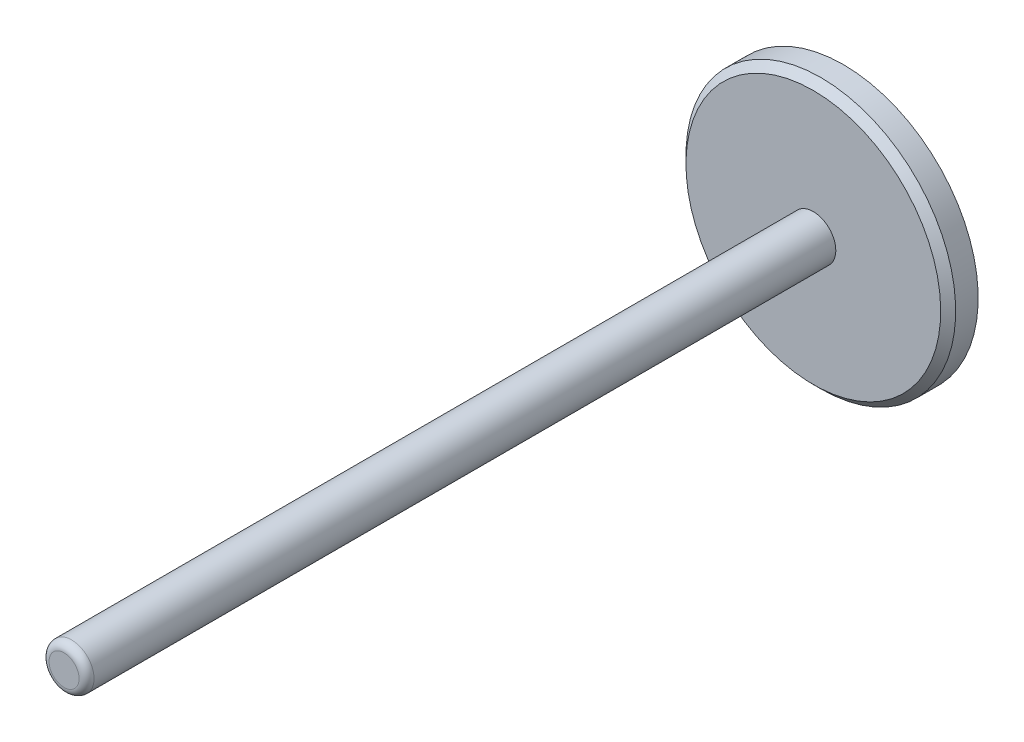
ISO-10303-21;
HEADER;
FILE_DESCRIPTION(('STEP AP214'),'2;1');
FILE_NAME('part.step','',(''),(''),'','','');
FILE_SCHEMA(('AUTOMOTIVE_DESIGN { 1 0 10303 214 1 1 1 1 }'));
ENDSEC;
DATA;
#1=APPLICATION_CONTEXT('core data for automotive mechanical design processes');
#2=APPLICATION_PROTOCOL_DEFINITION('international standard','automotive_design',2000,#1);
#3=PRODUCT_CONTEXT('',#1,'mechanical');
#4=PRODUCT('Part','Part','',(#3));
#5=PRODUCT_RELATED_PRODUCT_CATEGORY('part','',(#4));
#6=PRODUCT_DEFINITION_FORMATION('','',#4);
#7=PRODUCT_DEFINITION_CONTEXT('part definition',#1,'design');
#8=PRODUCT_DEFINITION('design','',#6,#7);
#9=PRODUCT_DEFINITION_SHAPE('','',#8);
#10=(LENGTH_UNIT() NAMED_UNIT(*) SI_UNIT(.MILLI.,.METRE.));
#11=(NAMED_UNIT(*) PLANE_ANGLE_UNIT() SI_UNIT($,.RADIAN.));
#12=(NAMED_UNIT(*) SI_UNIT($,.STERADIAN.) SOLID_ANGLE_UNIT());
#13=UNCERTAINTY_MEASURE_WITH_UNIT(LENGTH_MEASURE(1.E-05),#10,'distance_accuracy_value','');
#14=(GEOMETRIC_REPRESENTATION_CONTEXT(3) GLOBAL_UNCERTAINTY_ASSIGNED_CONTEXT((#13)) GLOBAL_UNIT_ASSIGNED_CONTEXT((#10,
#11,#12)) REPRESENTATION_CONTEXT('',''));
#15=CARTESIAN_POINT('',(0.,0.,0.));
#16=DIRECTION('',(0.,0.,1.));
#17=DIRECTION('',(1.,0.,0.));
#18=AXIS2_PLACEMENT_3D('',#15,#16,#17);
#19=CARTESIAN_POINT('',(0.,0.,-2.));
#20=DIRECTION('',(0.,0.,1.));
#21=DIRECTION('',(0.,-1.,0.));
#22=AXIS2_PLACEMENT_3D('',#19,#20,#21);
#23=PLANE('',#22);
#24=CARTESIAN_POINT('',(0.,0.,-2.));
#25=DIRECTION('',(0.,0.,-1.));
#26=DIRECTION('',(0.,1.,0.));
#27=AXIS2_PLACEMENT_3D('',#24,#25,#26);
#28=CIRCLE('',#27,9.);
#29=CARTESIAN_POINT('',(0.,9.,-2.));
#30=VERTEX_POINT('',#29);
#31=EDGE_CURVE('E63',#30,#30,#28,.T.);
#32=ORIENTED_EDGE('',*,*,#31,.T.);
#33=EDGE_LOOP('',(#32));
#34=FACE_BOUND('',#33,.T.);
#35=ADVANCED_FACE('F43',(#34),#23,.F.);
#36=CARTESIAN_POINT('',(0.,0.,-11.3700612452123));
#37=DIRECTION('',(0.,0.,-1.));
#38=DIRECTION('',(0.,1.,0.));
#39=AXIS2_PLACEMENT_3D('',#36,#37,#38);
#40=CYLINDRICAL_SURFACE('',#39,9.);
#41=CARTESIAN_POINT('',(0.,0.,-0.5));
#42=DIRECTION('',(0.,0.,-1.));
#43=DIRECTION('',(0.,1.,0.));
#44=AXIS2_PLACEMENT_3D('',#41,#42,#43);
#45=CIRCLE('',#44,9.);
#46=CARTESIAN_POINT('',(0.,9.,-0.500000000000004));
#47=VERTEX_POINT('',#46);
#48=EDGE_CURVE('E51',#47,#47,#45,.T.);
#49=ORIENTED_EDGE('',*,*,#48,.T.);
#50=EDGE_LOOP('',(#49));
#51=FACE_BOUND('',#50,.T.);
#52=ORIENTED_EDGE('',*,*,#31,.F.);
#53=EDGE_LOOP('',(#52));
#54=FACE_BOUND('',#53,.T.);
#55=ADVANCED_FACE('F88',(#51,#54),#40,.T.);
#56=CARTESIAN_POINT('',(0.,0.,0.));
#57=DIRECTION('',(0.,0.,-1.));
#58=DIRECTION('',(0.,1.,0.));
#59=AXIS2_PLACEMENT_3D('',#56,#57,#58);
#60=PLANE('',#59);
#61=CARTESIAN_POINT('',(0.,0.,0.));
#62=DIRECTION('',(0.,0.,-1.));
#63=DIRECTION('',(0.,1.,0.));
#64=AXIS2_PLACEMENT_3D('',#61,#62,#63);
#65=CIRCLE('',#64,8.49999999999999);
#66=CARTESIAN_POINT('',(0.,8.49999999999999,0.));
#67=VERTEX_POINT('',#66);
#68=EDGE_CURVE('E10',#67,#67,#65,.F.);
#69=ORIENTED_EDGE('',*,*,#68,.T.);
#70=EDGE_LOOP('',(#69));
#71=FACE_BOUND('',#70,.T.);
#72=CARTESIAN_POINT('',(0.,0.,0.));
#73=DIRECTION('',(0.,0.,-1.));
#74=DIRECTION('',(0.,1.,0.));
#75=AXIS2_PLACEMENT_3D('',#72,#73,#74);
#76=CIRCLE('',#75,1.5);
#77=CARTESIAN_POINT('',(0.,1.50000000000001,0.));
#78=VERTEX_POINT('',#77);
#79=EDGE_CURVE('E70',#78,#78,#76,.T.);
#80=ORIENTED_EDGE('',*,*,#79,.T.);
#81=EDGE_LOOP('',(#80));
#82=FACE_BOUND('',#81,.T.);
#83=ADVANCED_FACE('F72',(#71,#82),#60,.F.);
#84=CARTESIAN_POINT('',(0.,0.,-11.3700612452123));
#85=DIRECTION('',(0.,0.,-1.));
#86=DIRECTION('',(0.,1.,0.));
#87=AXIS2_PLACEMENT_3D('',#84,#85,#86);
#88=CYLINDRICAL_SURFACE('',#87,1.49999999999999);
#89=CARTESIAN_POINT('',(0.,0.,49.5));
#90=DIRECTION('',(0.,0.,-1.));
#91=DIRECTION('',(0.,1.,0.));
#92=AXIS2_PLACEMENT_3D('',#89,#90,#91);
#93=CIRCLE('',#92,1.49999999999999);
#94=CARTESIAN_POINT('',(0.,1.50000000000001,49.5));
#95=VERTEX_POINT('',#94);
#96=EDGE_CURVE('E56',#95,#95,#93,.T.);
#97=ORIENTED_EDGE('',*,*,#96,.T.);
#98=EDGE_LOOP('',(#97));
#99=FACE_BOUND('',#98,.T.);
#100=ORIENTED_EDGE('',*,*,#79,.F.);
#101=EDGE_LOOP('',(#100));
#102=FACE_BOUND('',#101,.T.);
#103=ADVANCED_FACE('F71',(#99,#102),#88,.T.);
#104=CARTESIAN_POINT('',(0.,0.,50.));
#105=DIRECTION('',(0.,0.,-1.));
#106=DIRECTION('',(0.,1.,0.));
#107=AXIS2_PLACEMENT_3D('',#104,#105,#106);
#108=PLANE('',#107);
#109=CARTESIAN_POINT('',(0.,0.,50.));
#110=DIRECTION('',(0.,0.,-1.));
#111=DIRECTION('',(0.,1.,0.));
#112=AXIS2_PLACEMENT_3D('',#109,#110,#111);
#113=CIRCLE('',#112,0.999999999999987);
#114=CARTESIAN_POINT('',(0.,1.00000000000001,50.));
#115=VERTEX_POINT('',#114);
#116=EDGE_CURVE('E54',#115,#115,#113,.F.);
#117=ORIENTED_EDGE('',*,*,#116,.T.);
#118=EDGE_LOOP('',(#117));
#119=FACE_BOUND('',#118,.T.);
#120=ADVANCED_FACE('F73',(#119),#108,.F.);
#121=CARTESIAN_POINT('',(0.,0.,49.5));
#122=DIRECTION('',(0.,0.,-1.));
#123=DIRECTION('',(0.,1.,0.));
#124=AXIS2_PLACEMENT_3D('',#121,#122,#123);
#125=TOROIDAL_SURFACE('',#124,0.999999999999987,0.5);
#126=ORIENTED_EDGE('',*,*,#116,.F.);
#127=EDGE_LOOP('',(#126));
#128=FACE_BOUND('',#127,.T.);
#129=ORIENTED_EDGE('',*,*,#96,.F.);
#130=EDGE_LOOP('',(#129));
#131=FACE_BOUND('',#130,.T.);
#132=ADVANCED_FACE('F85',(#128,#131),#125,.T.);
#133=CARTESIAN_POINT('',(0.,0.,-0.5));
#134=DIRECTION('',(0.,0.,-1.));
#135=DIRECTION('',(0.,1.,0.));
#136=AXIS2_PLACEMENT_3D('',#133,#134,#135);
#137=CONICAL_SURFACE('',#136,9.,0.785398163397455);
#138=ORIENTED_EDGE('',*,*,#68,.F.);
#139=EDGE_LOOP('',(#138));
#140=FACE_BOUND('',#139,.T.);
#141=ORIENTED_EDGE('',*,*,#48,.F.);
#142=EDGE_LOOP('',(#141));
#143=FACE_BOUND('',#142,.T.);
#144=ADVANCED_FACE('F46',(#140,#143),#137,.T.);
#145=CLOSED_SHELL('',(#35,#55,#83,#103,#120,#132,#144));
#146=MANIFOLD_SOLID_BREP('B2',#145);
#147=ADVANCED_BREP_SHAPE_REPRESENTATION('',(#18,#146),#14);
#148=SHAPE_DEFINITION_REPRESENTATION(#9,#147);
ENDSEC;
END-ISO-10303-21;
